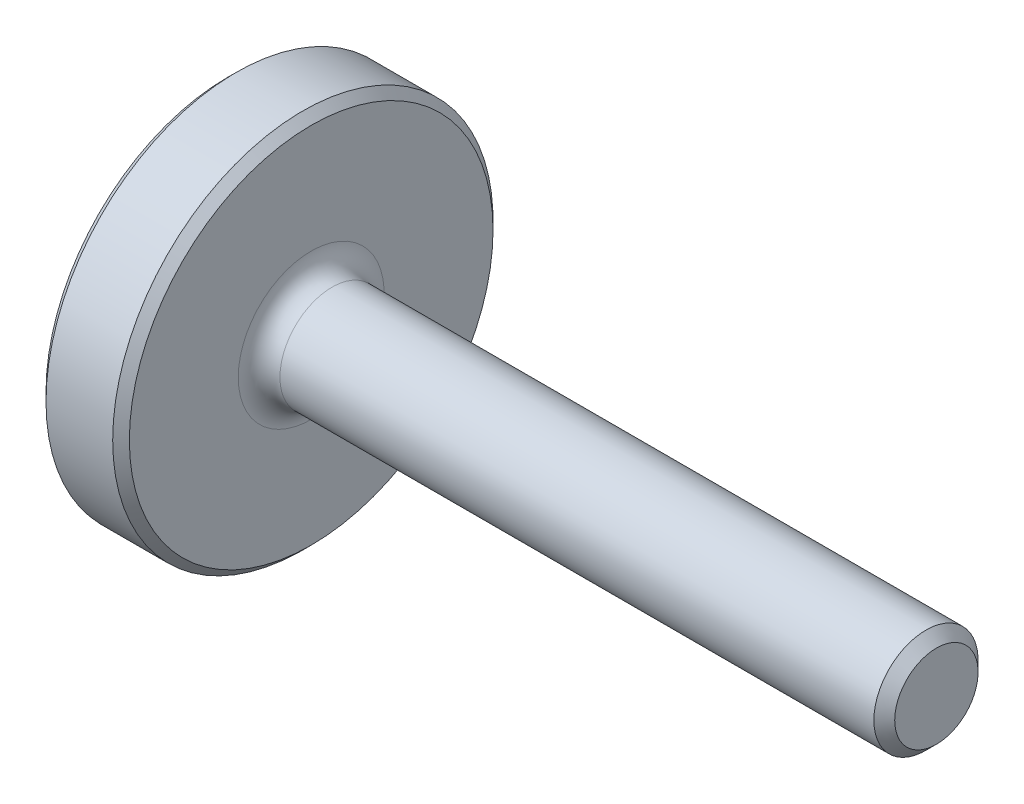
ISO-10303-21;
HEADER;
FILE_DESCRIPTION(('STEP AP214'),'2;1');
FILE_NAME('part.step','',(''),(''),'','','');
FILE_SCHEMA(('AUTOMOTIVE_DESIGN { 1 0 10303 214 1 1 1 1 }'));
ENDSEC;
DATA;
#1=APPLICATION_CONTEXT('core data for automotive mechanical design processes');
#2=APPLICATION_PROTOCOL_DEFINITION('international standard','automotive_design',2000,#1);
#3=PRODUCT_CONTEXT('',#1,'mechanical');
#4=PRODUCT('Part','Part','',(#3));
#5=PRODUCT_RELATED_PRODUCT_CATEGORY('part','',(#4));
#6=PRODUCT_DEFINITION_FORMATION('','',#4);
#7=PRODUCT_DEFINITION_CONTEXT('part definition',#1,'design');
#8=PRODUCT_DEFINITION('design','',#6,#7);
#9=PRODUCT_DEFINITION_SHAPE('','',#8);
#10=(LENGTH_UNIT() NAMED_UNIT(*) SI_UNIT(.MILLI.,.METRE.));
#11=(NAMED_UNIT(*) PLANE_ANGLE_UNIT() SI_UNIT($,.RADIAN.));
#12=(NAMED_UNIT(*) SI_UNIT($,.STERADIAN.) SOLID_ANGLE_UNIT());
#13=UNCERTAINTY_MEASURE_WITH_UNIT(LENGTH_MEASURE(1.E-05),#10,'distance_accuracy_value','');
#14=(GEOMETRIC_REPRESENTATION_CONTEXT(3) GLOBAL_UNCERTAINTY_ASSIGNED_CONTEXT((#13)) GLOBAL_UNIT_ASSIGNED_CONTEXT((#10,
#11,#12)) REPRESENTATION_CONTEXT('',''));
#15=CARTESIAN_POINT('',(0.,0.,0.));
#16=DIRECTION('',(0.,0.,1.));
#17=DIRECTION('',(1.,0.,0.));
#18=AXIS2_PLACEMENT_3D('',#15,#16,#17);
#19=CARTESIAN_POINT('',(68.,4.00000000000001,0.));
#20=DIRECTION('',(1.,0.,0.));
#21=DIRECTION('',(0.,0.,-1.));
#22=AXIS2_PLACEMENT_3D('',#19,#20,#21);
#23=PLANE('',#22);
#24=CARTESIAN_POINT('',(68.,0.,0.));
#25=DIRECTION('',(-1.,0.,0.));
#26=DIRECTION('',(0.,0.,1.));
#27=AXIS2_PLACEMENT_3D('',#24,#25,#26);
#28=CIRCLE('',#27,4.00000000000001);
#29=CARTESIAN_POINT('',(68.,0.,4.00000000000001));
#30=VERTEX_POINT('',#29);
#31=EDGE_CURVE('E41',#30,#30,#28,.T.);
#32=ORIENTED_EDGE('',*,*,#31,.F.);
#33=EDGE_LOOP('',(#32));
#34=FACE_BOUND('',#33,.T.);
#35=ADVANCED_FACE('F30',(#34),#23,.T.);
#36=CARTESIAN_POINT('',(67.,0.,0.));
#37=DIRECTION('',(-1.,0.,0.));
#38=DIRECTION('',(0.,0.,1.));
#39=AXIS2_PLACEMENT_3D('',#36,#37,#38);
#40=CONICAL_SURFACE('',#39,5.,0.785398163397444);
#41=ORIENTED_EDGE('',*,*,#31,.T.);
#42=EDGE_LOOP('',(#41));
#43=FACE_BOUND('',#42,.T.);
#44=CARTESIAN_POINT('',(67.,0.,0.));
#45=DIRECTION('',(-1.,0.,0.));
#46=DIRECTION('',(0.,0.,1.));
#47=AXIS2_PLACEMENT_3D('',#44,#45,#46);
#48=CIRCLE('',#47,5.);
#49=CARTESIAN_POINT('',(67.,0.,5.));
#50=VERTEX_POINT('',#49);
#51=EDGE_CURVE('E45',#50,#50,#48,.T.);
#52=ORIENTED_EDGE('',*,*,#51,.F.);
#53=EDGE_LOOP('',(#52));
#54=FACE_BOUND('',#53,.T.);
#55=ADVANCED_FACE('F83',(#43,#54),#40,.T.);
#56=CARTESIAN_POINT('',(-11.4007888018628,0.,0.));
#57=DIRECTION('',(-1.,0.,0.));
#58=DIRECTION('',(0.,0.,1.));
#59=AXIS2_PLACEMENT_3D('',#56,#57,#58);
#60=CYLINDRICAL_SURFACE('',#59,5.);
#61=CARTESIAN_POINT('',(10.,0.,0.));
#62=DIRECTION('',(-1.,0.,0.));
#63=DIRECTION('',(0.,0.,1.));
#64=AXIS2_PLACEMENT_3D('',#61,#62,#63);
#65=CIRCLE('',#64,5.);
#66=CARTESIAN_POINT('',(10.,0.,5.));
#67=VERTEX_POINT('',#66);
#68=EDGE_CURVE('E10',#67,#67,#65,.F.);
#69=ORIENTED_EDGE('',*,*,#68,.T.);
#70=EDGE_LOOP('',(#69));
#71=FACE_BOUND('',#70,.T.);
#72=ORIENTED_EDGE('',*,*,#51,.T.);
#73=EDGE_LOOP('',(#72));
#74=FACE_BOUND('',#73,.T.);
#75=ADVANCED_FACE('F88',(#71,#74),#60,.T.);
#76=CARTESIAN_POINT('',(8.,5.,0.));
#77=DIRECTION('',(-1.,0.,0.));
#78=DIRECTION('',(0.,0.,1.));
#79=AXIS2_PLACEMENT_3D('',#76,#77,#78);
#80=PLANE('',#79);
#81=CARTESIAN_POINT('',(8.,0.,0.));
#82=DIRECTION('',(-1.,0.,0.));
#83=DIRECTION('',(0.,0.,1.));
#84=AXIS2_PLACEMENT_3D('',#81,#82,#83);
#85=CIRCLE('',#84,7.);
#86=CARTESIAN_POINT('',(8.,0.,7.));
#87=VERTEX_POINT('',#86);
#88=EDGE_CURVE('E37',#87,#87,#85,.T.);
#89=ORIENTED_EDGE('',*,*,#88,.T.);
#90=EDGE_LOOP('',(#89));
#91=FACE_BOUND('',#90,.T.);
#92=CARTESIAN_POINT('',(8.,0.,0.));
#93=DIRECTION('',(-1.,0.,0.));
#94=DIRECTION('',(0.,0.,1.));
#95=AXIS2_PLACEMENT_3D('',#92,#93,#94);
#96=CIRCLE('',#95,17.45);
#97=CARTESIAN_POINT('',(8.,0.,17.45));
#98=VERTEX_POINT('',#97);
#99=EDGE_CURVE('E50',#98,#98,#96,.T.);
#100=ORIENTED_EDGE('',*,*,#99,.F.);
#101=EDGE_LOOP('',(#100));
#102=FACE_BOUND('',#101,.T.);
#103=ADVANCED_FACE('F79',(#91,#102),#80,.F.);
#104=CARTESIAN_POINT('',(7.2,0.,0.));
#105=DIRECTION('',(-1.,0.,0.));
#106=DIRECTION('',(0.,0.,1.));
#107=AXIS2_PLACEMENT_3D('',#104,#105,#106);
#108=CONICAL_SURFACE('',#107,18.25,0.785398163397453);
#109=ORIENTED_EDGE('',*,*,#99,.T.);
#110=EDGE_LOOP('',(#109));
#111=FACE_BOUND('',#110,.T.);
#112=CARTESIAN_POINT('',(7.2,0.,0.));
#113=DIRECTION('',(-1.,0.,0.));
#114=DIRECTION('',(0.,0.,1.));
#115=AXIS2_PLACEMENT_3D('',#112,#113,#114);
#116=CIRCLE('',#115,18.25);
#117=CARTESIAN_POINT('',(7.2,0.,18.25));
#118=VERTEX_POINT('',#117);
#119=EDGE_CURVE('E53',#118,#118,#116,.T.);
#120=ORIENTED_EDGE('',*,*,#119,.F.);
#121=EDGE_LOOP('',(#120));
#122=FACE_BOUND('',#121,.T.);
#123=ADVANCED_FACE('F73',(#111,#122),#108,.T.);
#124=CARTESIAN_POINT('',(-11.4007888018628,0.,0.));
#125=DIRECTION('',(-1.,0.,0.));
#126=DIRECTION('',(0.,0.,1.));
#127=AXIS2_PLACEMENT_3D('',#124,#125,#126);
#128=CYLINDRICAL_SURFACE('',#127,18.25);
#129=ORIENTED_EDGE('',*,*,#119,.T.);
#130=EDGE_LOOP('',(#129));
#131=FACE_BOUND('',#130,.T.);
#132=CARTESIAN_POINT('',(0.8,0.,0.));
#133=DIRECTION('',(-1.,0.,0.));
#134=DIRECTION('',(0.,0.,1.));
#135=AXIS2_PLACEMENT_3D('',#132,#133,#134);
#136=CIRCLE('',#135,18.25);
#137=CARTESIAN_POINT('',(0.8,0.,18.25));
#138=VERTEX_POINT('',#137);
#139=EDGE_CURVE('E56',#138,#138,#136,.T.);
#140=ORIENTED_EDGE('',*,*,#139,.F.);
#141=EDGE_LOOP('',(#140));
#142=FACE_BOUND('',#141,.T.);
#143=ADVANCED_FACE('F68',(#131,#142),#128,.T.);
#144=CARTESIAN_POINT('',(0.8,0.,0.));
#145=DIRECTION('',(1.,0.,0.));
#146=DIRECTION('',(0.,0.,-1.));
#147=AXIS2_PLACEMENT_3D('',#144,#145,#146);
#148=CONICAL_SURFACE('',#147,18.25,0.785398163397452);
#149=CARTESIAN_POINT('',(0.,0.,0.));
#150=DIRECTION('',(-1.,0.,0.));
#151=DIRECTION('',(0.,0.,1.));
#152=AXIS2_PLACEMENT_3D('',#149,#150,#151);
#153=CIRCLE('',#152,17.45);
#154=CARTESIAN_POINT('',(0.,0.,17.45));
#155=VERTEX_POINT('',#154);
#156=EDGE_CURVE('E59',#155,#155,#153,.T.);
#157=ORIENTED_EDGE('',*,*,#156,.F.);
#158=EDGE_LOOP('',(#157));
#159=FACE_BOUND('',#158,.T.);
#160=ORIENTED_EDGE('',*,*,#139,.T.);
#161=EDGE_LOOP('',(#160));
#162=FACE_BOUND('',#161,.T.);
#163=ADVANCED_FACE('F65',(#159,#162),#148,.T.);
#164=CARTESIAN_POINT('',(0.,0.,0.));
#165=DIRECTION('',(-1.,0.,0.));
#166=DIRECTION('',(0.,0.,1.));
#167=AXIS2_PLACEMENT_3D('',#164,#165,#166);
#168=PLANE('',#167);
#169=ORIENTED_EDGE('',*,*,#156,.T.);
#170=EDGE_LOOP('',(#169));
#171=FACE_BOUND('',#170,.T.);
#172=ADVANCED_FACE('F63',(#171),#168,.T.);
#173=CARTESIAN_POINT('',(10.,0.,0.));
#174=DIRECTION('',(-1.,0.,0.));
#175=DIRECTION('',(0.,0.,1.));
#176=AXIS2_PLACEMENT_3D('',#173,#174,#175);
#177=TOROIDAL_SURFACE('',#176,7.,2.);
#178=ORIENTED_EDGE('',*,*,#68,.F.);
#179=EDGE_LOOP('',(#178));
#180=FACE_BOUND('',#179,.T.);
#181=ORIENTED_EDGE('',*,*,#88,.F.);
#182=EDGE_LOOP('',(#181));
#183=FACE_BOUND('',#182,.T.);
#184=ADVANCED_FACE('F32',(#180,#183),#177,.F.);
#185=CLOSED_SHELL('',(#35,#55,#75,#103,#123,#143,#163,#172,#184));
#186=MANIFOLD_SOLID_BREP('B2',#185);
#187=ADVANCED_BREP_SHAPE_REPRESENTATION('',(#18,#186),#14);
#188=SHAPE_DEFINITION_REPRESENTATION(#9,#187);
ENDSEC;
END-ISO-10303-21;
